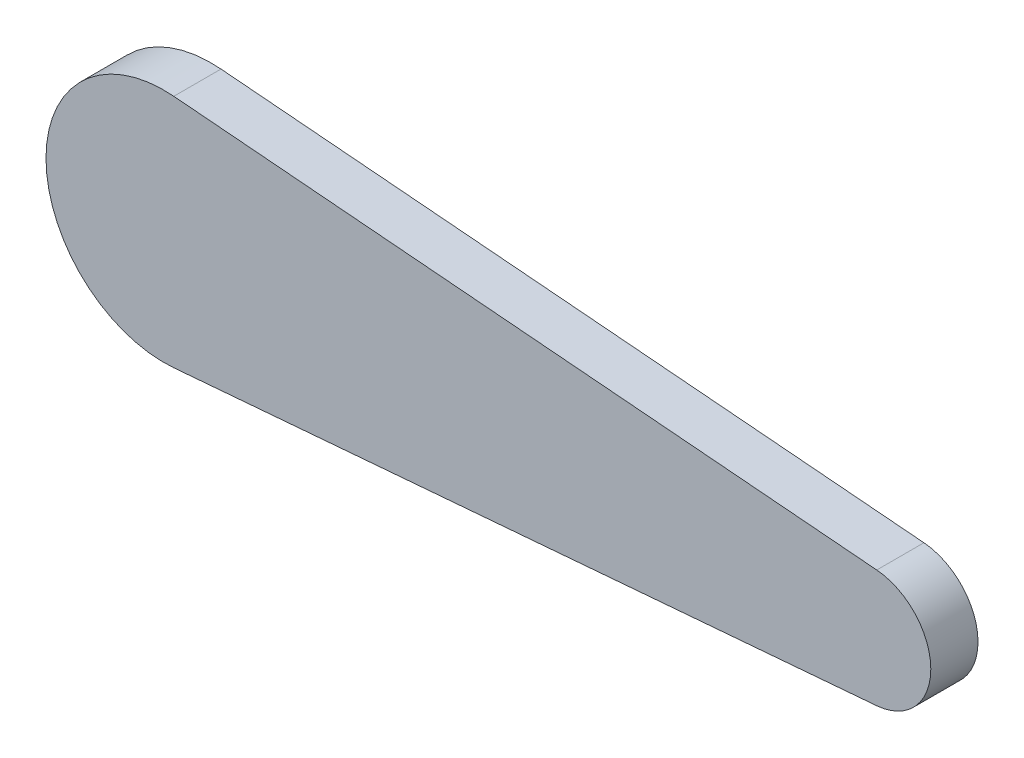
ISO-10303-21;
HEADER;
FILE_DESCRIPTION(('STEP AP214'),'2;1');
FILE_NAME('part.step','',(''),(''),'','','');
FILE_SCHEMA(('AUTOMOTIVE_DESIGN { 1 0 10303 214 1 1 1 1 }'));
ENDSEC;
DATA;
#1=APPLICATION_CONTEXT('core data for automotive mechanical design processes');
#2=APPLICATION_PROTOCOL_DEFINITION('international standard','automotive_design',2000,#1);
#3=PRODUCT_CONTEXT('',#1,'mechanical');
#4=PRODUCT('Part','Part','',(#3));
#5=PRODUCT_RELATED_PRODUCT_CATEGORY('part','',(#4));
#6=PRODUCT_DEFINITION_FORMATION('','',#4);
#7=PRODUCT_DEFINITION_CONTEXT('part definition',#1,'design');
#8=PRODUCT_DEFINITION('design','',#6,#7);
#9=PRODUCT_DEFINITION_SHAPE('','',#8);
#10=(LENGTH_UNIT() NAMED_UNIT(*) SI_UNIT(.MILLI.,.METRE.));
#11=(NAMED_UNIT(*) PLANE_ANGLE_UNIT() SI_UNIT($,.RADIAN.));
#12=(NAMED_UNIT(*) SI_UNIT($,.STERADIAN.) SOLID_ANGLE_UNIT());
#13=UNCERTAINTY_MEASURE_WITH_UNIT(LENGTH_MEASURE(1.E-05),#10,'distance_accuracy_value','');
#14=(GEOMETRIC_REPRESENTATION_CONTEXT(3) GLOBAL_UNCERTAINTY_ASSIGNED_CONTEXT((#13)) GLOBAL_UNIT_ASSIGNED_CONTEXT((#10,
#11,#12)) REPRESENTATION_CONTEXT('',''));
#15=CARTESIAN_POINT('',(0.,0.,0.));
#16=DIRECTION('',(0.,0.,1.));
#17=DIRECTION('',(1.,0.,0.));
#18=AXIS2_PLACEMENT_3D('',#15,#16,#17);
#19=CARTESIAN_POINT('',(0.,0.,20.));
#20=DIRECTION('',(0.,0.,-1.));
#21=DIRECTION('',(-1.,0.,0.));
#22=AXIS2_PLACEMENT_3D('',#19,#20,#21);
#23=CYLINDRICAL_SURFACE('',#22,50.);
#24=CARTESIAN_POINT('',(0.,0.,0.));
#25=DIRECTION('',(0.,0.,1.));
#26=DIRECTION('',(1.,0.,0.));
#27=AXIS2_PLACEMENT_3D('',#24,#25,#26);
#28=CIRCLE('',#27,50.);
#29=CARTESIAN_POINT('',(4.16666666666667,49.8260864295891,0.));
#30=VERTEX_POINT('',#29);
#31=CARTESIAN_POINT('',(4.16666666666666,-49.8260864295891,0.));
#32=VERTEX_POINT('',#31);
#33=EDGE_CURVE('E112',#30,#32,#28,.T.);
#34=ORIENTED_EDGE('',*,*,#33,.T.);
#35=DIRECTION('',(0.,0.,-1.));
#36=VECTOR('',#35,1.);
#37=CARTESIAN_POINT('',(4.16666666666666,-49.8260864295891,20.));
#38=LINE('',#37,#36);
#39=CARTESIAN_POINT('',(4.16666666666666,-49.8260864295891,20.));
#40=VERTEX_POINT('',#39);
#41=EDGE_CURVE('E50',#40,#32,#38,.T.);
#42=ORIENTED_EDGE('',*,*,#41,.F.);
#43=CARTESIAN_POINT('',(0.,0.,20.));
#44=DIRECTION('',(0.,0.,1.));
#45=DIRECTION('',(1.,0.,0.));
#46=AXIS2_PLACEMENT_3D('',#43,#44,#45);
#47=CIRCLE('',#46,50.);
#48=CARTESIAN_POINT('',(4.16666666666667,49.8260864295891,20.));
#49=VERTEX_POINT('',#48);
#50=EDGE_CURVE('E92',#49,#40,#47,.T.);
#51=ORIENTED_EDGE('',*,*,#50,.F.);
#52=DIRECTION('',(0.,0.,-1.));
#53=VECTOR('',#52,1.);
#54=CARTESIAN_POINT('',(4.16666666666667,49.8260864295891,20.));
#55=LINE('',#54,#53);
#56=EDGE_CURVE('E58',#49,#30,#55,.T.);
#57=ORIENTED_EDGE('',*,*,#56,.T.);
#58=EDGE_LOOP('',(#34,#42,#51,#57));
#59=FACE_BOUND('',#58,.T.);
#60=ADVANCED_FACE('F41',(#59),#23,.T.);
#61=CARTESIAN_POINT('',(4.16666666666666,-49.8260864295891,20.));
#62=DIRECTION('',(-0.0833333333333333,0.996521728591783,0.));
#63=DIRECTION('',(-0.996521728591783,-0.0833333333333333,0.));
#64=AXIS2_PLACEMENT_3D('',#61,#62,#63);
#65=PLANE('',#64);
#66=DIRECTION('',(0.996521728591783,0.0833333333333333,0.));
#67=VECTOR('',#66,1.);
#68=CARTESIAN_POINT('',(4.16666666666666,-49.8260864295891,0.));
#69=LINE('',#68,#67);
#70=CARTESIAN_POINT('',(302.083333333333,-24.9130432147946,0.));
#71=VERTEX_POINT('',#70);
#72=EDGE_CURVE('E99',#32,#71,#69,.T.);
#73=ORIENTED_EDGE('',*,*,#72,.T.);
#74=DIRECTION('',(0.,0.,-1.));
#75=VECTOR('',#74,1.);
#76=CARTESIAN_POINT('',(302.083333333333,-24.9130432147946,20.));
#77=LINE('',#76,#75);
#78=CARTESIAN_POINT('',(302.083333333333,-24.9130432147946,20.));
#79=VERTEX_POINT('',#78);
#80=EDGE_CURVE('E97',#79,#71,#77,.T.);
#81=ORIENTED_EDGE('',*,*,#80,.F.);
#82=DIRECTION('',(0.996521728591783,0.0833333333333333,0.));
#83=VECTOR('',#82,1.);
#84=CARTESIAN_POINT('',(4.16666666666666,-49.8260864295891,20.));
#85=LINE('',#84,#83);
#86=EDGE_CURVE('E85',#40,#79,#85,.T.);
#87=ORIENTED_EDGE('',*,*,#86,.F.);
#88=ORIENTED_EDGE('',*,*,#41,.T.);
#89=EDGE_LOOP('',(#73,#81,#87,#88));
#90=FACE_BOUND('',#89,.T.);
#91=ADVANCED_FACE('F98',(#90),#65,.F.);
#92=CARTESIAN_POINT('',(300.,0.,20.));
#93=DIRECTION('',(0.,0.,-1.));
#94=DIRECTION('',(-1.,0.,0.));
#95=AXIS2_PLACEMENT_3D('',#92,#93,#94);
#96=CYLINDRICAL_SURFACE('',#95,25.);
#97=CARTESIAN_POINT('',(300.,0.,0.));
#98=DIRECTION('',(0.,0.,1.));
#99=DIRECTION('',(1.,0.,0.));
#100=AXIS2_PLACEMENT_3D('',#97,#98,#99);
#101=CIRCLE('',#100,25.);
#102=CARTESIAN_POINT('',(302.083333333333,24.9130432147946,0.));
#103=VERTEX_POINT('',#102);
#104=EDGE_CURVE('E118',#71,#103,#101,.T.);
#105=ORIENTED_EDGE('',*,*,#104,.T.);
#106=DIRECTION('',(0.,0.,-1.));
#107=VECTOR('',#106,1.);
#108=CARTESIAN_POINT('',(302.083333333333,24.9130432147946,20.));
#109=LINE('',#108,#107);
#110=CARTESIAN_POINT('',(302.083333333333,24.9130432147946,20.));
#111=VERTEX_POINT('',#110);
#112=EDGE_CURVE('E73',#111,#103,#109,.T.);
#113=ORIENTED_EDGE('',*,*,#112,.F.);
#114=CARTESIAN_POINT('',(300.,0.,20.));
#115=DIRECTION('',(0.,0.,1.));
#116=DIRECTION('',(1.,0.,0.));
#117=AXIS2_PLACEMENT_3D('',#114,#115,#116);
#118=CIRCLE('',#117,25.);
#119=EDGE_CURVE('E91',#79,#111,#118,.T.);
#120=ORIENTED_EDGE('',*,*,#119,.F.);
#121=ORIENTED_EDGE('',*,*,#80,.T.);
#122=EDGE_LOOP('',(#105,#113,#120,#121));
#123=FACE_BOUND('',#122,.T.);
#124=ADVANCED_FACE('F104',(#123),#96,.T.);
#125=CARTESIAN_POINT('',(4.16666666666666,49.8260864295891,20.));
#126=DIRECTION('',(0.0833333333333333,0.996521728591783,0.));
#127=DIRECTION('',(-0.996521728591783,0.0833333333333333,0.));
#128=AXIS2_PLACEMENT_3D('',#125,#126,#127);
#129=PLANE('',#128);
#130=DIRECTION('',(0.996521728591783,-0.0833333333333333,0.));
#131=VECTOR('',#130,1.);
#132=CARTESIAN_POINT('',(4.16666666666666,49.8260864295891,0.));
#133=LINE('',#132,#131);
#134=EDGE_CURVE('E121',#30,#103,#133,.T.);
#135=ORIENTED_EDGE('',*,*,#134,.F.);
#136=ORIENTED_EDGE('',*,*,#56,.F.);
#137=DIRECTION('',(0.996521728591783,-0.0833333333333333,0.));
#138=VECTOR('',#137,1.);
#139=CARTESIAN_POINT('',(4.16666666666666,49.8260864295891,20.));
#140=LINE('',#139,#138);
#141=EDGE_CURVE('E106',#49,#111,#140,.T.);
#142=ORIENTED_EDGE('',*,*,#141,.T.);
#143=ORIENTED_EDGE('',*,*,#112,.T.);
#144=EDGE_LOOP('',(#135,#136,#142,#143));
#145=FACE_BOUND('',#144,.T.);
#146=ADVANCED_FACE('F131',(#145),#129,.T.);
#147=CARTESIAN_POINT('',(0.,0.,20.));
#148=DIRECTION('',(0.,0.,1.));
#149=DIRECTION('',(1.,0.,0.));
#150=AXIS2_PLACEMENT_3D('',#147,#148,#149);
#151=PLANE('',#150);
#152=ORIENTED_EDGE('',*,*,#50,.T.);
#153=ORIENTED_EDGE('',*,*,#86,.T.);
#154=ORIENTED_EDGE('',*,*,#119,.T.);
#155=ORIENTED_EDGE('',*,*,#141,.F.);
#156=EDGE_LOOP('',(#152,#153,#154,#155));
#157=FACE_BOUND('',#156,.T.);
#158=ADVANCED_FACE('F88',(#157),#151,.T.);
#159=CARTESIAN_POINT('',(0.,0.,0.));
#160=DIRECTION('',(0.,0.,1.));
#161=DIRECTION('',(1.,0.,0.));
#162=AXIS2_PLACEMENT_3D('',#159,#160,#161);
#163=PLANE('',#162);
#164=CARTESIAN_POINT('',(0.,0.,0.));
#165=DIRECTION('',(0.,0.,1.));
#166=DIRECTION('',(1.,0.,0.));
#167=AXIS2_PLACEMENT_3D('',#164,#165,#166);
#168=CIRCLE('',#167,25.);
#169=CARTESIAN_POINT('',(25.,0.,0.));
#170=VERTEX_POINT('',#169);
#171=EDGE_CURVE('E11',#170,#170,#168,.F.);
#172=ORIENTED_EDGE('',*,*,#171,.F.);
#173=EDGE_LOOP('',(#172));
#174=FACE_BOUND('',#173,.T.);
#175=ORIENTED_EDGE('',*,*,#33,.F.);
#176=ORIENTED_EDGE('',*,*,#134,.T.);
#177=ORIENTED_EDGE('',*,*,#104,.F.);
#178=ORIENTED_EDGE('',*,*,#72,.F.);
#179=EDGE_LOOP('',(#175,#176,#177,#178));
#180=FACE_BOUND('',#179,.T.);
#181=ADVANCED_FACE('F130',(#174,#180),#163,.F.);
#182=CARTESIAN_POINT('',(0.,0.,-20.));
#183=DIRECTION('',(0.,0.,1.));
#184=DIRECTION('',(1.,0.,0.));
#185=AXIS2_PLACEMENT_3D('',#182,#183,#184);
#186=CYLINDRICAL_SURFACE('',#185,25.);
#187=CARTESIAN_POINT('',(0.,0.,-20.));
#188=DIRECTION('',(0.,0.,-1.));
#189=DIRECTION('',(-1.,0.,0.));
#190=AXIS2_PLACEMENT_3D('',#187,#188,#189);
#191=CIRCLE('',#190,25.);
#192=CARTESIAN_POINT('',(-25.,0.,-20.));
#193=VERTEX_POINT('',#192);
#194=EDGE_CURVE('E115',#193,#193,#191,.T.);
#195=ORIENTED_EDGE('',*,*,#194,.F.);
#196=EDGE_LOOP('',(#195));
#197=FACE_BOUND('',#196,.T.);
#198=ORIENTED_EDGE('',*,*,#171,.T.);
#199=EDGE_LOOP('',(#198));
#200=FACE_BOUND('',#199,.T.);
#201=ADVANCED_FACE('F173',(#197,#200),#186,.T.);
#202=CARTESIAN_POINT('',(0.,0.,-20.));
#203=DIRECTION('',(0.,0.,-1.));
#204=DIRECTION('',(-1.,0.,0.));
#205=AXIS2_PLACEMENT_3D('',#202,#203,#204);
#206=PLANE('',#205);
#207=ORIENTED_EDGE('',*,*,#194,.T.);
#208=EDGE_LOOP('',(#207));
#209=FACE_BOUND('',#208,.T.);
#210=ADVANCED_FACE('F183',(#209),#206,.T.);
#211=CLOSED_SHELL('',(#60,#91,#124,#146,#158,#181,#201,#210));
#212=MANIFOLD_SOLID_BREP('B2',#211);
#213=ADVANCED_BREP_SHAPE_REPRESENTATION('',(#18,#212),#14);
#214=SHAPE_DEFINITION_REPRESENTATION(#9,#213);
ENDSEC;
END-ISO-10303-21;
